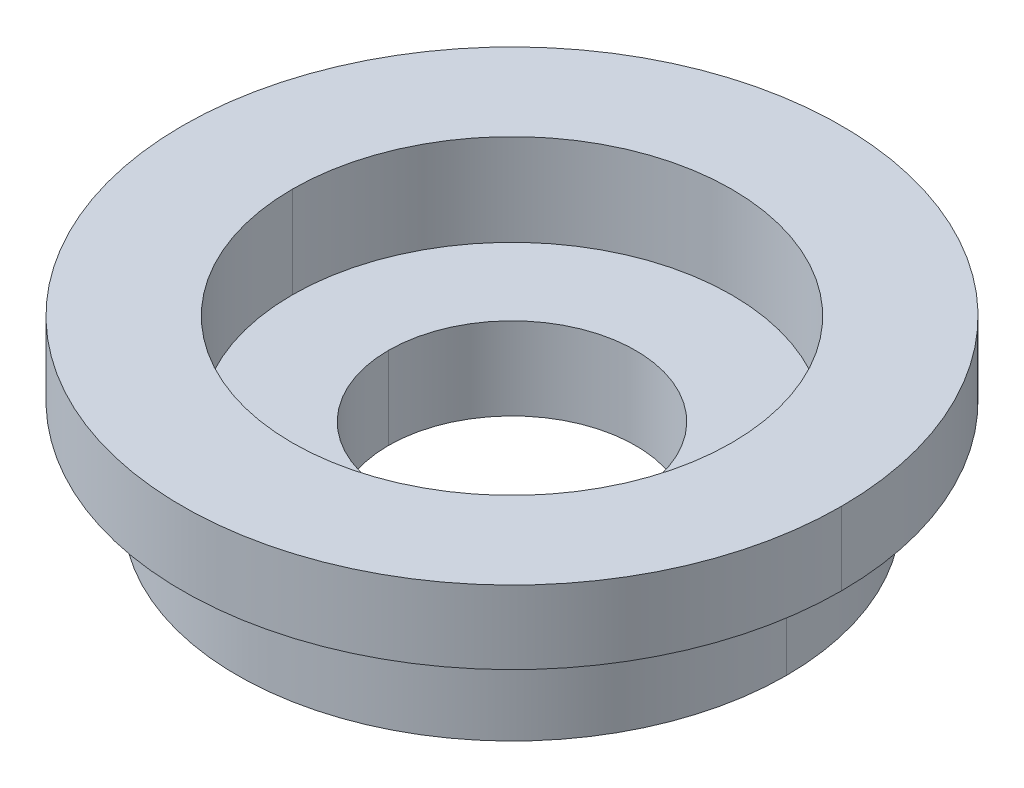
ISO-10303-21;
HEADER;
FILE_DESCRIPTION(('STEP AP214'),'2;1');
FILE_NAME('part.step','',(''),(''),'','','');
FILE_SCHEMA(('AUTOMOTIVE_DESIGN { 1 0 10303 214 1 1 1 1 }'));
ENDSEC;
DATA;
#1=APPLICATION_CONTEXT('core data for automotive mechanical design processes');
#2=APPLICATION_PROTOCOL_DEFINITION('international standard','automotive_design',2000,#1);
#3=PRODUCT_CONTEXT('',#1,'mechanical');
#4=PRODUCT('Part','Part','',(#3));
#5=PRODUCT_RELATED_PRODUCT_CATEGORY('part','',(#4));
#6=PRODUCT_DEFINITION_FORMATION('','',#4);
#7=PRODUCT_DEFINITION_CONTEXT('part definition',#1,'design');
#8=PRODUCT_DEFINITION('design','',#6,#7);
#9=PRODUCT_DEFINITION_SHAPE('','',#8);
#10=(LENGTH_UNIT() NAMED_UNIT(*) SI_UNIT(.MILLI.,.METRE.));
#11=(NAMED_UNIT(*) PLANE_ANGLE_UNIT() SI_UNIT($,.RADIAN.));
#12=(NAMED_UNIT(*) SI_UNIT($,.STERADIAN.) SOLID_ANGLE_UNIT());
#13=UNCERTAINTY_MEASURE_WITH_UNIT(LENGTH_MEASURE(1.E-05),#10,'distance_accuracy_value','');
#14=(GEOMETRIC_REPRESENTATION_CONTEXT(3) GLOBAL_UNCERTAINTY_ASSIGNED_CONTEXT((#13)) GLOBAL_UNIT_ASSIGNED_CONTEXT((#10,
#11,#12)) REPRESENTATION_CONTEXT('',''));
#15=CARTESIAN_POINT('',(0.,0.,0.));
#16=DIRECTION('',(0.,0.,1.));
#17=DIRECTION('',(1.,0.,0.));
#18=AXIS2_PLACEMENT_3D('',#15,#16,#17);
#19=CARTESIAN_POINT('',(0.,0.,0.));
#20=DIRECTION('',(0.,1.,0.));
#21=DIRECTION('',(1.,0.,0.));
#22=AXIS2_PLACEMENT_3D('',#19,#20,#21);
#23=CYLINDRICAL_SURFACE('',#22,1.35);
#24=DIRECTION('',(0.,1.,0.));
#25=VECTOR('',#24,1.);
#26=CARTESIAN_POINT('',(-1.35,0.,0.));
#27=LINE('',#26,#25);
#28=CARTESIAN_POINT('',(-1.35,0.,0.));
#29=VERTEX_POINT('',#28);
#30=CARTESIAN_POINT('',(-1.35,0.9,0.));
#31=VERTEX_POINT('',#30);
#32=EDGE_CURVE('E101',#29,#31,#27,.T.);
#33=ORIENTED_EDGE('',*,*,#32,.F.);
#34=CARTESIAN_POINT('',(0.,0.,0.));
#35=DIRECTION('',(0.,-1.,0.));
#36=DIRECTION('',(-1.,0.,0.));
#37=AXIS2_PLACEMENT_3D('',#34,#35,#36);
#38=CIRCLE('',#37,1.35);
#39=CARTESIAN_POINT('',(1.35,0.,0.));
#40=VERTEX_POINT('',#39);
#41=EDGE_CURVE('E20',#29,#40,#38,.T.);
#42=ORIENTED_EDGE('',*,*,#41,.T.);
#43=DIRECTION('',(0.,1.,0.));
#44=VECTOR('',#43,1.);
#45=CARTESIAN_POINT('',(1.35,0.,0.));
#46=LINE('',#45,#44);
#47=CARTESIAN_POINT('',(1.35,0.9,0.));
#48=VERTEX_POINT('',#47);
#49=EDGE_CURVE('E99',#40,#48,#46,.T.);
#50=ORIENTED_EDGE('',*,*,#49,.T.);
#51=CARTESIAN_POINT('',(0.,0.9,0.));
#52=DIRECTION('',(0.,1.,0.));
#53=DIRECTION('',(1.,0.,0.));
#54=AXIS2_PLACEMENT_3D('',#51,#52,#53);
#55=CIRCLE('',#54,1.35);
#56=EDGE_CURVE('E84',#48,#31,#55,.T.);
#57=ORIENTED_EDGE('',*,*,#56,.T.);
#58=EDGE_LOOP('',(#33,#42,#50,#57));
#59=FACE_BOUND('',#58,.T.);
#60=ADVANCED_FACE('F17',(#59),#23,.F.);
#61=CARTESIAN_POINT('',(0.,1.9,0.));
#62=DIRECTION('',(0.,1.,0.));
#63=DIRECTION('',(1.,0.,0.));
#64=AXIS2_PLACEMENT_3D('',#61,#62,#63);
#65=CYLINDRICAL_SURFACE('',#64,2.4);
#66=DIRECTION('',(0.,-1.,0.));
#67=VECTOR('',#66,1.);
#68=CARTESIAN_POINT('',(2.4,1.9,0.));
#69=LINE('',#68,#67);
#70=CARTESIAN_POINT('',(2.4,1.9,0.));
#71=VERTEX_POINT('',#70);
#72=CARTESIAN_POINT('',(2.4,0.9,0.));
#73=VERTEX_POINT('',#72);
#74=EDGE_CURVE('E127',#71,#73,#69,.T.);
#75=ORIENTED_EDGE('',*,*,#74,.T.);
#76=CARTESIAN_POINT('',(0.,0.9,0.));
#77=DIRECTION('',(0.,1.,0.));
#78=DIRECTION('',(-1.,0.,0.));
#79=AXIS2_PLACEMENT_3D('',#76,#77,#78);
#80=CIRCLE('',#79,2.4);
#81=CARTESIAN_POINT('',(-2.4,0.9,0.));
#82=VERTEX_POINT('',#81);
#83=EDGE_CURVE('E103',#82,#73,#80,.T.);
#84=ORIENTED_EDGE('',*,*,#83,.F.);
#85=DIRECTION('',(0.,-1.,0.));
#86=VECTOR('',#85,1.);
#87=CARTESIAN_POINT('',(-2.4,1.9,0.));
#88=LINE('',#87,#86);
#89=CARTESIAN_POINT('',(-2.4,1.9,0.));
#90=VERTEX_POINT('',#89);
#91=EDGE_CURVE('E93',#90,#82,#88,.T.);
#92=ORIENTED_EDGE('',*,*,#91,.F.);
#93=CARTESIAN_POINT('',(0.,1.9,0.));
#94=DIRECTION('',(0.,1.,0.));
#95=DIRECTION('',(-1.,0.,0.));
#96=AXIS2_PLACEMENT_3D('',#93,#94,#95);
#97=CIRCLE('',#96,2.4);
#98=EDGE_CURVE('E121',#90,#71,#97,.T.);
#99=ORIENTED_EDGE('',*,*,#98,.T.);
#100=EDGE_LOOP('',(#75,#84,#92,#99));
#101=FACE_BOUND('',#100,.T.);
#102=ADVANCED_FACE('F181',(#101),#65,.F.);
#103=CARTESIAN_POINT('',(0.,0.,0.));
#104=DIRECTION('',(0.,1.,0.));
#105=DIRECTION('',(1.,0.,0.));
#106=AXIS2_PLACEMENT_3D('',#103,#104,#105);
#107=CYLINDRICAL_SURFACE('',#106,3.6);
#108=DIRECTION('',(0.,1.,0.));
#109=VECTOR('',#108,1.);
#110=CARTESIAN_POINT('',(3.6,1.1,0.));
#111=LINE('',#110,#109);
#112=CARTESIAN_POINT('',(3.6,1.1,0.));
#113=VERTEX_POINT('',#112);
#114=CARTESIAN_POINT('',(3.6,1.9,0.));
#115=VERTEX_POINT('',#114);
#116=EDGE_CURVE('E149',#113,#115,#111,.T.);
#117=ORIENTED_EDGE('',*,*,#116,.T.);
#118=CARTESIAN_POINT('',(0.,1.9,0.));
#119=DIRECTION('',(0.,1.,0.));
#120=DIRECTION('',(-1.,0.,0.));
#121=AXIS2_PLACEMENT_3D('',#118,#119,#120);
#122=CIRCLE('',#121,3.6);
#123=CARTESIAN_POINT('',(-3.6,1.9,0.));
#124=VERTEX_POINT('',#123);
#125=EDGE_CURVE('E126',#124,#115,#122,.T.);
#126=ORIENTED_EDGE('',*,*,#125,.F.);
#127=DIRECTION('',(0.,1.,0.));
#128=VECTOR('',#127,1.);
#129=CARTESIAN_POINT('',(-3.6,1.1,0.));
#130=LINE('',#129,#128);
#131=CARTESIAN_POINT('',(-3.6,1.1,0.));
#132=VERTEX_POINT('',#131);
#133=EDGE_CURVE('E145',#132,#124,#130,.T.);
#134=ORIENTED_EDGE('',*,*,#133,.F.);
#135=CARTESIAN_POINT('',(0.,1.1,0.));
#136=DIRECTION('',(0.,1.,0.));
#137=DIRECTION('',(-1.,0.,0.));
#138=AXIS2_PLACEMENT_3D('',#135,#136,#137);
#139=CIRCLE('',#138,3.6);
#140=EDGE_CURVE('E156',#132,#113,#139,.T.);
#141=ORIENTED_EDGE('',*,*,#140,.T.);
#142=EDGE_LOOP('',(#117,#126,#134,#141));
#143=FACE_BOUND('',#142,.T.);
#144=ADVANCED_FACE('F208',(#143),#107,.T.);
#145=CARTESIAN_POINT('',(0.,0.,0.));
#146=DIRECTION('',(0.,-1.,0.));
#147=DIRECTION('',(-1.,0.,0.));
#148=AXIS2_PLACEMENT_3D('',#145,#146,#147);
#149=CYLINDRICAL_SURFACE('',#148,3.);
#150=DIRECTION('',(0.,1.,0.));
#151=VECTOR('',#150,1.);
#152=CARTESIAN_POINT('',(-3.,0.,0.));
#153=LINE('',#152,#151);
#154=CARTESIAN_POINT('',(-3.,0.,0.));
#155=VERTEX_POINT('',#154);
#156=CARTESIAN_POINT('',(-3.,1.1,0.));
#157=VERTEX_POINT('',#156);
#158=EDGE_CURVE('E11',#155,#157,#153,.T.);
#159=ORIENTED_EDGE('',*,*,#158,.T.);
#160=CARTESIAN_POINT('',(0.,1.1,0.));
#161=DIRECTION('',(0.,1.,0.));
#162=DIRECTION('',(1.,0.,0.));
#163=AXIS2_PLACEMENT_3D('',#160,#161,#162);
#164=CIRCLE('',#163,3.);
#165=CARTESIAN_POINT('',(3.,1.1,0.));
#166=VERTEX_POINT('',#165);
#167=EDGE_CURVE('E198',#166,#157,#164,.T.);
#168=ORIENTED_EDGE('',*,*,#167,.F.);
#169=DIRECTION('',(0.,1.,0.));
#170=VECTOR('',#169,1.);
#171=CARTESIAN_POINT('',(3.,0.,0.));
#172=LINE('',#171,#170);
#173=CARTESIAN_POINT('',(3.,0.,0.));
#174=VERTEX_POINT('',#173);
#175=EDGE_CURVE('E27',#174,#166,#172,.T.);
#176=ORIENTED_EDGE('',*,*,#175,.F.);
#177=CARTESIAN_POINT('',(0.,0.,0.));
#178=DIRECTION('',(0.,-1.,0.));
#179=DIRECTION('',(-1.,0.,0.));
#180=AXIS2_PLACEMENT_3D('',#177,#178,#179);
#181=CIRCLE('',#180,3.);
#182=EDGE_CURVE('E157',#155,#174,#181,.T.);
#183=ORIENTED_EDGE('',*,*,#182,.F.);
#184=EDGE_LOOP('',(#159,#168,#176,#183));
#185=FACE_BOUND('',#184,.T.);
#186=ADVANCED_FACE('F296',(#185),#149,.T.);
#187=CARTESIAN_POINT('',(0.,0.,0.));
#188=DIRECTION('',(0.,-1.,0.));
#189=DIRECTION('',(-1.,0.,0.));
#190=AXIS2_PLACEMENT_3D('',#187,#188,#189);
#191=CYLINDRICAL_SURFACE('',#190,3.);
#192=ORIENTED_EDGE('',*,*,#175,.T.);
#193=CARTESIAN_POINT('',(0.,1.1,0.));
#194=DIRECTION('',(0.,1.,0.));
#195=DIRECTION('',(-1.,0.,0.));
#196=AXIS2_PLACEMENT_3D('',#193,#194,#195);
#197=CIRCLE('',#196,3.);
#198=EDGE_CURVE('E201',#157,#166,#197,.T.);
#199=ORIENTED_EDGE('',*,*,#198,.F.);
#200=ORIENTED_EDGE('',*,*,#158,.F.);
#201=CARTESIAN_POINT('',(0.,0.,0.));
#202=DIRECTION('',(0.,-1.,0.));
#203=DIRECTION('',(1.,0.,0.));
#204=AXIS2_PLACEMENT_3D('',#201,#202,#203);
#205=CIRCLE('',#204,3.);
#206=EDGE_CURVE('E160',#174,#155,#205,.T.);
#207=ORIENTED_EDGE('',*,*,#206,.F.);
#208=EDGE_LOOP('',(#192,#199,#200,#207));
#209=FACE_BOUND('',#208,.T.);
#210=ADVANCED_FACE('F244',(#209),#191,.T.);
#211=CARTESIAN_POINT('',(0.,1.1,0.));
#212=DIRECTION('',(0.,-1.,0.));
#213=DIRECTION('',(0.,0.,-1.));
#214=AXIS2_PLACEMENT_3D('',#211,#212,#213);
#215=PLANE('',#214);
#216=ORIENTED_EDGE('',*,*,#167,.T.);
#217=ORIENTED_EDGE('',*,*,#198,.T.);
#218=EDGE_LOOP('',(#216,#217));
#219=FACE_BOUND('',#218,.T.);
#220=ORIENTED_EDGE('',*,*,#140,.F.);
#221=CARTESIAN_POINT('',(0.,1.1,0.));
#222=DIRECTION('',(0.,1.,0.));
#223=DIRECTION('',(1.,0.,0.));
#224=AXIS2_PLACEMENT_3D('',#221,#222,#223);
#225=CIRCLE('',#224,3.6);
#226=EDGE_CURVE('E153',#113,#132,#225,.T.);
#227=ORIENTED_EDGE('',*,*,#226,.F.);
#228=EDGE_LOOP('',(#220,#227));
#229=FACE_BOUND('',#228,.T.);
#230=ADVANCED_FACE('F211',(#219,#229),#215,.T.);
#231=CARTESIAN_POINT('',(0.,0.,0.));
#232=DIRECTION('',(0.,1.,0.));
#233=DIRECTION('',(1.,0.,0.));
#234=AXIS2_PLACEMENT_3D('',#231,#232,#233);
#235=CYLINDRICAL_SURFACE('',#234,3.6);
#236=ORIENTED_EDGE('',*,*,#133,.T.);
#237=CARTESIAN_POINT('',(0.,1.9,0.));
#238=DIRECTION('',(0.,1.,0.));
#239=DIRECTION('',(1.,0.,0.));
#240=AXIS2_PLACEMENT_3D('',#237,#238,#239);
#241=CIRCLE('',#240,3.6);
#242=EDGE_CURVE('E132',#115,#124,#241,.T.);
#243=ORIENTED_EDGE('',*,*,#242,.F.);
#244=ORIENTED_EDGE('',*,*,#116,.F.);
#245=ORIENTED_EDGE('',*,*,#226,.T.);
#246=EDGE_LOOP('',(#236,#243,#244,#245));
#247=FACE_BOUND('',#246,.T.);
#248=ADVANCED_FACE('F213',(#247),#235,.T.);
#249=CARTESIAN_POINT('',(0.,1.9,0.));
#250=DIRECTION('',(0.,1.,0.));
#251=DIRECTION('',(1.,0.,0.));
#252=AXIS2_PLACEMENT_3D('',#249,#250,#251);
#253=PLANE('',#252);
#254=ORIENTED_EDGE('',*,*,#98,.F.);
#255=CARTESIAN_POINT('',(0.,1.9,0.));
#256=DIRECTION('',(0.,1.,0.));
#257=DIRECTION('',(1.,0.,0.));
#258=AXIS2_PLACEMENT_3D('',#255,#256,#257);
#259=CIRCLE('',#258,2.4);
#260=EDGE_CURVE('E123',#71,#90,#259,.T.);
#261=ORIENTED_EDGE('',*,*,#260,.F.);
#262=EDGE_LOOP('',(#254,#261));
#263=FACE_BOUND('',#262,.T.);
#264=ORIENTED_EDGE('',*,*,#125,.T.);
#265=ORIENTED_EDGE('',*,*,#242,.T.);
#266=EDGE_LOOP('',(#264,#265));
#267=FACE_BOUND('',#266,.T.);
#268=ADVANCED_FACE('F253',(#263,#267),#253,.T.);
#269=CARTESIAN_POINT('',(0.,1.9,0.));
#270=DIRECTION('',(0.,1.,0.));
#271=DIRECTION('',(1.,0.,0.));
#272=AXIS2_PLACEMENT_3D('',#269,#270,#271);
#273=CYLINDRICAL_SURFACE('',#272,2.4);
#274=ORIENTED_EDGE('',*,*,#91,.T.);
#275=CARTESIAN_POINT('',(0.,0.9,0.));
#276=DIRECTION('',(0.,1.,0.));
#277=DIRECTION('',(1.,0.,0.));
#278=AXIS2_PLACEMENT_3D('',#275,#276,#277);
#279=CIRCLE('',#278,2.4);
#280=EDGE_CURVE('E94',#73,#82,#279,.T.);
#281=ORIENTED_EDGE('',*,*,#280,.F.);
#282=ORIENTED_EDGE('',*,*,#74,.F.);
#283=ORIENTED_EDGE('',*,*,#260,.T.);
#284=EDGE_LOOP('',(#274,#281,#282,#283));
#285=FACE_BOUND('',#284,.T.);
#286=ADVANCED_FACE('F188',(#285),#273,.F.);
#287=CARTESIAN_POINT('',(0.,0.9,0.));
#288=DIRECTION('',(0.,1.,0.));
#289=DIRECTION('',(1.,0.,0.));
#290=AXIS2_PLACEMENT_3D('',#287,#288,#289);
#291=PLANE('',#290);
#292=ORIENTED_EDGE('',*,*,#56,.F.);
#293=CARTESIAN_POINT('',(0.,0.9,0.));
#294=DIRECTION('',(0.,1.,0.));
#295=DIRECTION('',(-1.,0.,0.));
#296=AXIS2_PLACEMENT_3D('',#293,#294,#295);
#297=CIRCLE('',#296,1.35);
#298=EDGE_CURVE('E88',#31,#48,#297,.T.);
#299=ORIENTED_EDGE('',*,*,#298,.F.);
#300=EDGE_LOOP('',(#292,#299));
#301=FACE_BOUND('',#300,.T.);
#302=ORIENTED_EDGE('',*,*,#83,.T.);
#303=ORIENTED_EDGE('',*,*,#280,.T.);
#304=EDGE_LOOP('',(#302,#303));
#305=FACE_BOUND('',#304,.T.);
#306=ADVANCED_FACE('F86',(#301,#305),#291,.T.);
#307=CARTESIAN_POINT('',(0.,0.,0.));
#308=DIRECTION('',(0.,1.,0.));
#309=DIRECTION('',(1.,0.,0.));
#310=AXIS2_PLACEMENT_3D('',#307,#308,#309);
#311=CYLINDRICAL_SURFACE('',#310,1.35);
#312=ORIENTED_EDGE('',*,*,#49,.F.);
#313=CARTESIAN_POINT('',(0.,0.,0.));
#314=DIRECTION('',(0.,-1.,0.));
#315=DIRECTION('',(1.,0.,0.));
#316=AXIS2_PLACEMENT_3D('',#313,#314,#315);
#317=CIRCLE('',#316,1.35);
#318=EDGE_CURVE('E108',#40,#29,#317,.T.);
#319=ORIENTED_EDGE('',*,*,#318,.T.);
#320=ORIENTED_EDGE('',*,*,#32,.T.);
#321=ORIENTED_EDGE('',*,*,#298,.T.);
#322=EDGE_LOOP('',(#312,#319,#320,#321));
#323=FACE_BOUND('',#322,.T.);
#324=ADVANCED_FACE('F97',(#323),#311,.F.);
#325=CARTESIAN_POINT('',(0.,0.,0.));
#326=DIRECTION('',(0.,1.,0.));
#327=DIRECTION('',(1.,0.,0.));
#328=AXIS2_PLACEMENT_3D('',#325,#326,#327);
#329=PLANE('',#328);
#330=ORIENTED_EDGE('',*,*,#41,.F.);
#331=ORIENTED_EDGE('',*,*,#318,.F.);
#332=EDGE_LOOP('',(#330,#331));
#333=FACE_BOUND('',#332,.T.);
#334=ORIENTED_EDGE('',*,*,#182,.T.);
#335=ORIENTED_EDGE('',*,*,#206,.T.);
#336=EDGE_LOOP('',(#334,#335));
#337=FACE_BOUND('',#336,.T.);
#338=ADVANCED_FACE('F279',(#333,#337),#329,.F.);
#339=CLOSED_SHELL('',(#60,#102,#144,#186,#210,#230,#248,#268,#286,#306,#324,#338));
#340=MANIFOLD_SOLID_BREP('B1',#339);
#341=ADVANCED_BREP_SHAPE_REPRESENTATION('',(#18,#340),#14);
#342=SHAPE_DEFINITION_REPRESENTATION(#9,#341);
ENDSEC;
END-ISO-10303-21;
